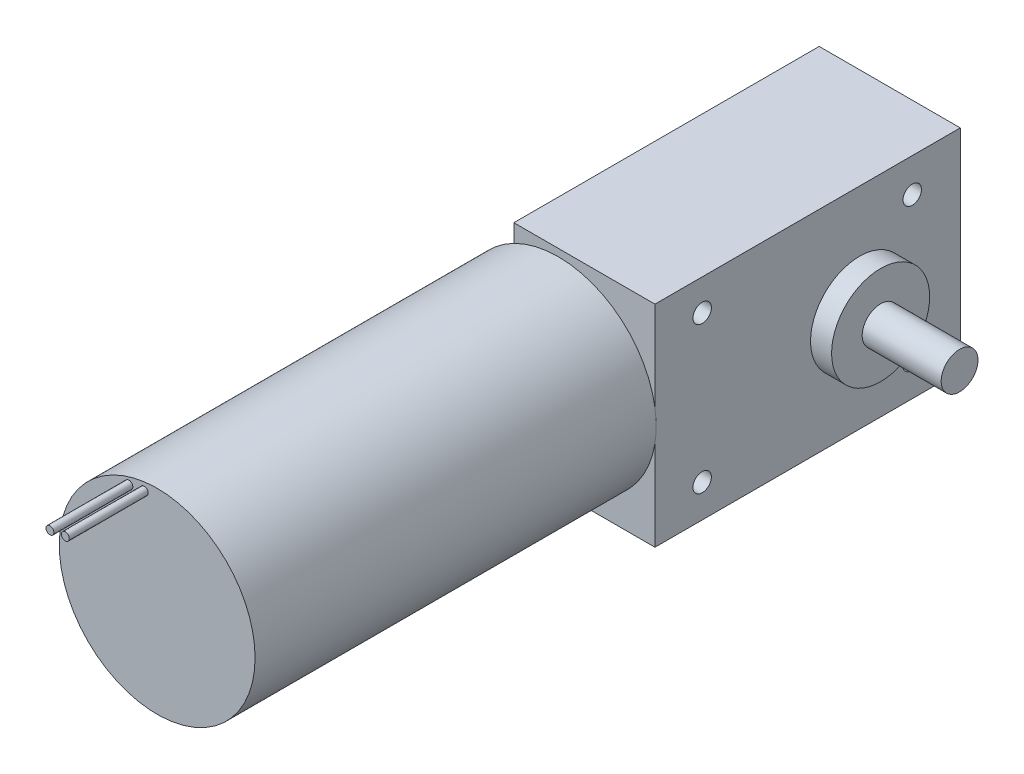
ISO-10303-21;
HEADER;
FILE_DESCRIPTION(('STEP AP214'),'2;1');
FILE_NAME('part.step','',(''),(''),'','','');
FILE_SCHEMA(('AUTOMOTIVE_DESIGN { 1 0 10303 214 1 1 1 1 }'));
ENDSEC;
DATA;
#1=APPLICATION_CONTEXT('core data for automotive mechanical design processes');
#2=APPLICATION_PROTOCOL_DEFINITION('international standard','automotive_design',2000,#1);
#3=PRODUCT_CONTEXT('',#1,'mechanical');
#4=PRODUCT('Part','Part','',(#3));
#5=PRODUCT_RELATED_PRODUCT_CATEGORY('part','',(#4));
#6=PRODUCT_DEFINITION_FORMATION('','',#4);
#7=PRODUCT_DEFINITION_CONTEXT('part definition',#1,'design');
#8=PRODUCT_DEFINITION('design','',#6,#7);
#9=PRODUCT_DEFINITION_SHAPE('','',#8);
#10=(LENGTH_UNIT() NAMED_UNIT(*) SI_UNIT(.MILLI.,.METRE.));
#11=(NAMED_UNIT(*) PLANE_ANGLE_UNIT() SI_UNIT($,.RADIAN.));
#12=(NAMED_UNIT(*) SI_UNIT($,.STERADIAN.) SOLID_ANGLE_UNIT());
#13=UNCERTAINTY_MEASURE_WITH_UNIT(LENGTH_MEASURE(1.E-05),#10,'distance_accuracy_value','');
#14=(GEOMETRIC_REPRESENTATION_CONTEXT(3) GLOBAL_UNCERTAINTY_ASSIGNED_CONTEXT((#13)) GLOBAL_UNIT_ASSIGNED_CONTEXT((#10,
#11,#12)) REPRESENTATION_CONTEXT('',''));
#15=CARTESIAN_POINT('',(0.,0.,0.));
#16=DIRECTION('',(0.,0.,1.));
#17=DIRECTION('',(1.,0.,0.));
#18=AXIS2_PLACEMENT_3D('',#15,#16,#17);
#19=CARTESIAN_POINT('',(-63.8568563516663,21.8656771156772,0.));
#20=DIRECTION('',(0.,0.,1.));
#21=DIRECTION('',(1.,0.,0.));
#22=AXIS2_PLACEMENT_3D('',#19,#20,#21);
#23=PLANE('',#22);
#24=DIRECTION('',(0.,1.,0.));
#25=VECTOR('',#24,1.);
#26=CARTESIAN_POINT('',(-72.2953043376536,41.8359502095322,0.));
#27=LINE('',#26,#25);
#28=CARTESIAN_POINT('',(-72.2953043376536,5.29001436609803,0.));
#29=VERTEX_POINT('',#28);
#30=CARTESIAN_POINT('',(-72.2953043376536,38.4413398652564,0.));
#31=VERTEX_POINT('',#30);
#32=EDGE_CURVE('E48',#29,#31,#27,.T.);
#33=ORIENTED_EDGE('',*,*,#32,.F.);
#34=CARTESIAN_POINT('',(-63.8568563516663,21.8656771156772,0.));
#35=DIRECTION('',(0.,0.,1.));
#36=DIRECTION('',(1.,0.,0.));
#37=AXIS2_PLACEMENT_3D('',#34,#35,#36);
#38=CIRCLE('',#37,18.6);
#39=EDGE_CURVE('E51',#31,#29,#38,.T.);
#40=ORIENTED_EDGE('',*,*,#39,.F.);
#41=EDGE_LOOP('',(#33,#40));
#42=FACE_BOUND('',#41,.T.);
#43=ADVANCED_FACE('F33',(#42),#23,.F.);
#44=DIRECTION('',(0.,-1.,0.));
#45=VECTOR('',#44,1.);
#46=CARTESIAN_POINT('',(-45.4953043376536,41.8359502095322,0.));
#47=LINE('',#46,#45);
#48=CARTESIAN_POINT('',(-45.4953043376536,24.8344155070998,0.));
#49=VERTEX_POINT('',#48);
#50=CARTESIAN_POINT('',(-45.4953043376536,18.8969387242547,0.));
#51=VERTEX_POINT('',#50);
#52=EDGE_CURVE('E132',#49,#51,#47,.T.);
#53=ORIENTED_EDGE('',*,*,#52,.F.);
#54=EDGE_CURVE('E126',#51,#49,#38,.T.);
#55=ORIENTED_EDGE('',*,*,#54,.F.);
#56=EDGE_LOOP('',(#53,#55));
#57=FACE_BOUND('',#56,.T.);
#58=ADVANCED_FACE('F199',(#57),#23,.F.);
#59=CARTESIAN_POINT('',(-63.8568563516663,21.8656771156772,76.2));
#60=DIRECTION('',(0.,0.,-1.));
#61=DIRECTION('',(-1.,0.,0.));
#62=AXIS2_PLACEMENT_3D('',#59,#60,#61);
#63=CYLINDRICAL_SURFACE('',#62,18.6);
#64=CARTESIAN_POINT('',(-63.8568563516663,21.8656771156772,76.2));
#65=DIRECTION('',(0.,0.,1.));
#66=DIRECTION('',(1.,0.,0.));
#67=AXIS2_PLACEMENT_3D('',#64,#65,#66);
#68=CIRCLE('',#67,18.6);
#69=CARTESIAN_POINT('',(-45.2568563516663,21.8656771156772,76.2));
#70=VERTEX_POINT('',#69);
#71=EDGE_CURVE('E129',#70,#70,#68,.T.);
#72=ORIENTED_EDGE('',*,*,#71,.F.);
#73=EDGE_LOOP('',(#72));
#74=FACE_BOUND('',#73,.T.);
#75=EDGE_CURVE('E133',#49,#31,#38,.T.);
#76=ORIENTED_EDGE('',*,*,#75,.T.);
#77=ORIENTED_EDGE('',*,*,#39,.T.);
#78=EDGE_CURVE('E177',#29,#51,#38,.T.);
#79=ORIENTED_EDGE('',*,*,#78,.T.);
#80=ORIENTED_EDGE('',*,*,#54,.T.);
#81=EDGE_LOOP('',(#76,#77,#79,#80));
#82=FACE_BOUND('',#81,.T.);
#83=ADVANCED_FACE('F35',(#74,#82),#63,.T.);
#84=CARTESIAN_POINT('',(-63.8568563516663,21.8656771156772,76.2));
#85=DIRECTION('',(0.,0.,1.));
#86=DIRECTION('',(1.,0.,0.));
#87=AXIS2_PLACEMENT_3D('',#84,#85,#86);
#88=PLANE('',#87);
#89=CARTESIAN_POINT('',(-69.2248738329369,38.3649913808313,76.2));
#90=DIRECTION('',(0.,0.,1.));
#91=DIRECTION('',(1.,0.,0.));
#92=AXIS2_PLACEMENT_3D('',#89,#90,#91);
#93=CIRCLE('',#92,0.749999999999999);
#94=CARTESIAN_POINT('',(-68.4748738329369,38.3649913808313,76.2));
#95=VERTEX_POINT('',#94);
#96=EDGE_CURVE('E111',#95,#95,#93,.T.);
#97=ORIENTED_EDGE('',*,*,#96,.F.);
#98=EDGE_LOOP('',(#97));
#99=FACE_BOUND('',#98,.T.);
#100=CARTESIAN_POINT('',(-66.3052965506381,38.820097554833,76.2));
#101=DIRECTION('',(0.,0.,1.));
#102=DIRECTION('',(1.,0.,0.));
#103=AXIS2_PLACEMENT_3D('',#100,#101,#102);
#104=CIRCLE('',#103,0.749999999999999);
#105=CARTESIAN_POINT('',(-65.5552965506381,38.820097554833,76.2));
#106=VERTEX_POINT('',#105);
#107=EDGE_CURVE('E121',#106,#106,#104,.T.);
#108=ORIENTED_EDGE('',*,*,#107,.F.);
#109=EDGE_LOOP('',(#108));
#110=FACE_BOUND('',#109,.T.);
#111=ORIENTED_EDGE('',*,*,#71,.T.);
#112=EDGE_LOOP('',(#111));
#113=FACE_BOUND('',#112,.T.);
#114=ADVANCED_FACE('F204',(#99,#110,#113),#88,.T.);
#115=CARTESIAN_POINT('',(-66.3052965506381,38.820097554833,91.2));
#116=DIRECTION('',(0.,0.,-1.));
#117=DIRECTION('',(-1.,0.,0.));
#118=AXIS2_PLACEMENT_3D('',#115,#116,#117);
#119=CYLINDRICAL_SURFACE('',#118,0.749999999999999);
#120=CARTESIAN_POINT('',(-66.3052965506381,38.820097554833,91.2));
#121=DIRECTION('',(0.,0.,1.));
#122=DIRECTION('',(1.,0.,0.));
#123=AXIS2_PLACEMENT_3D('',#120,#121,#122);
#124=CIRCLE('',#123,0.749999999999999);
#125=CARTESIAN_POINT('',(-65.5552965506381,38.820097554833,91.2));
#126=VERTEX_POINT('',#125);
#127=EDGE_CURVE('E123',#126,#126,#124,.T.);
#128=ORIENTED_EDGE('',*,*,#127,.F.);
#129=EDGE_LOOP('',(#128));
#130=FACE_BOUND('',#129,.T.);
#131=ORIENTED_EDGE('',*,*,#107,.T.);
#132=EDGE_LOOP('',(#131));
#133=FACE_BOUND('',#132,.T.);
#134=ADVANCED_FACE('F207',(#130,#133),#119,.T.);
#135=CARTESIAN_POINT('',(-66.3052965506381,38.820097554833,91.2));
#136=DIRECTION('',(0.,0.,1.));
#137=DIRECTION('',(1.,0.,0.));
#138=AXIS2_PLACEMENT_3D('',#135,#136,#137);
#139=PLANE('',#138);
#140=ORIENTED_EDGE('',*,*,#127,.T.);
#141=EDGE_LOOP('',(#140));
#142=FACE_BOUND('',#141,.T.);
#143=ADVANCED_FACE('F211',(#142),#139,.T.);
#144=CARTESIAN_POINT('',(-69.2248738329369,38.3649913808313,91.2));
#145=DIRECTION('',(0.,0.,-1.));
#146=DIRECTION('',(-1.,0.,0.));
#147=AXIS2_PLACEMENT_3D('',#144,#145,#146);
#148=CYLINDRICAL_SURFACE('',#147,0.749999999999999);
#149=CARTESIAN_POINT('',(-69.2248738329369,38.3649913808313,91.2));
#150=DIRECTION('',(0.,0.,1.));
#151=DIRECTION('',(1.,0.,0.));
#152=AXIS2_PLACEMENT_3D('',#149,#150,#151);
#153=CIRCLE('',#152,0.749999999999999);
#154=CARTESIAN_POINT('',(-68.4748738329369,38.3649913808313,91.2));
#155=VERTEX_POINT('',#154);
#156=EDGE_CURVE('E114',#155,#155,#153,.T.);
#157=ORIENTED_EDGE('',*,*,#156,.F.);
#158=EDGE_LOOP('',(#157));
#159=FACE_BOUND('',#158,.T.);
#160=ORIENTED_EDGE('',*,*,#96,.T.);
#161=EDGE_LOOP('',(#160));
#162=FACE_BOUND('',#161,.T.);
#163=ADVANCED_FACE('F193',(#159,#162),#148,.T.);
#164=CARTESIAN_POINT('',(-69.2248738329369,38.3649913808313,91.2));
#165=DIRECTION('',(0.,0.,1.));
#166=DIRECTION('',(1.,0.,0.));
#167=AXIS2_PLACEMENT_3D('',#164,#165,#166);
#168=PLANE('',#167);
#169=ORIENTED_EDGE('',*,*,#156,.T.);
#170=EDGE_LOOP('',(#169));
#171=FACE_BOUND('',#170,.T.);
#172=ADVANCED_FACE('F187',(#171),#168,.T.);
#173=CARTESIAN_POINT('',(0.,0.,0.));
#174=DIRECTION('',(0.,0.,1.));
#175=DIRECTION('',(1.,0.,0.));
#176=AXIS2_PLACEMENT_3D('',#173,#174,#175);
#177=PLANE('',#176);
#178=ORIENTED_EDGE('',*,*,#75,.F.);
#179=CARTESIAN_POINT('',(-45.4953043376536,41.8359502095322,0.));
#180=VERTEX_POINT('',#179);
#181=EDGE_CURVE('E143',#180,#49,#47,.T.);
#182=ORIENTED_EDGE('',*,*,#181,.F.);
#183=DIRECTION('',(1.,0.,0.));
#184=VECTOR('',#183,1.);
#185=CARTESIAN_POINT('',(-72.2953043376536,41.8359502095322,0.));
#186=LINE('',#185,#184);
#187=CARTESIAN_POINT('',(-72.2953043376536,41.8359502095322,0.));
#188=VERTEX_POINT('',#187);
#189=EDGE_CURVE('E147',#188,#180,#186,.T.);
#190=ORIENTED_EDGE('',*,*,#189,.F.);
#191=EDGE_CURVE('E109',#31,#188,#27,.T.);
#192=ORIENTED_EDGE('',*,*,#191,.F.);
#193=EDGE_LOOP('',(#178,#182,#190,#192));
#194=FACE_BOUND('',#193,.T.);
#195=ADVANCED_FACE('F185',(#194),#177,.T.);
#196=ORIENTED_EDGE('',*,*,#78,.F.);
#197=CARTESIAN_POINT('',(-72.2953043376536,1.8359502095322,0.));
#198=VERTEX_POINT('',#197);
#199=EDGE_CURVE('E140',#198,#29,#27,.T.);
#200=ORIENTED_EDGE('',*,*,#199,.F.);
#201=DIRECTION('',(-1.,0.,0.));
#202=VECTOR('',#201,1.);
#203=CARTESIAN_POINT('',(-72.2953043376536,1.8359502095322,0.));
#204=LINE('',#203,#202);
#205=CARTESIAN_POINT('',(-45.4953043376536,1.8359502095322,0.));
#206=VERTEX_POINT('',#205);
#207=EDGE_CURVE('E104',#206,#198,#204,.T.);
#208=ORIENTED_EDGE('',*,*,#207,.F.);
#209=EDGE_CURVE('E144',#51,#206,#47,.T.);
#210=ORIENTED_EDGE('',*,*,#209,.F.);
#211=EDGE_LOOP('',(#196,#200,#208,#210));
#212=FACE_BOUND('',#211,.T.);
#213=ADVANCED_FACE('F176',(#212),#177,.T.);
#214=CARTESIAN_POINT('',(-72.2953043376536,41.8359502095322,-58.));
#215=DIRECTION('',(1.,0.,0.));
#216=DIRECTION('',(0.,0.,-1.));
#217=AXIS2_PLACEMENT_3D('',#214,#215,#216);
#218=PLANE('',#217);
#219=CARTESIAN_POINT('',(-72.2953043376536,21.2359502095322,-38.6));
#220=DIRECTION('',(1.,0.,0.));
#221=DIRECTION('',(0.,0.,-1.));
#222=AXIS2_PLACEMENT_3D('',#219,#220,#221);
#223=CIRCLE('',#222,9.4);
#224=CARTESIAN_POINT('',(-72.2953043376536,21.2359502095322,-48.));
#225=VERTEX_POINT('',#224);
#226=EDGE_CURVE('E134',#225,#225,#223,.F.);
#227=ORIENTED_EDGE('',*,*,#226,.F.);
#228=EDGE_LOOP('',(#227));
#229=FACE_BOUND('',#228,.T.);
#230=CARTESIAN_POINT('',(-72.2953043376536,6.7759502095322,-9.15));
#231=DIRECTION('',(-1.,0.,0.));
#232=DIRECTION('',(0.,0.,1.));
#233=AXIS2_PLACEMENT_3D('',#230,#231,#232);
#234=CIRCLE('',#233,1.75);
#235=CARTESIAN_POINT('',(-72.2953043376536,6.7759502095322,-7.4));
#236=VERTEX_POINT('',#235);
#237=EDGE_CURVE('E356',#236,#236,#234,.T.);
#238=ORIENTED_EDGE('',*,*,#237,.F.);
#239=EDGE_LOOP('',(#238));
#240=FACE_BOUND('',#239,.T.);
#241=CARTESIAN_POINT('',(-72.2953043376536,6.7759502095322,-48.85));
#242=DIRECTION('',(-1.,0.,0.));
#243=DIRECTION('',(0.,0.,1.));
#244=AXIS2_PLACEMENT_3D('',#241,#242,#243);
#245=CIRCLE('',#244,1.75);
#246=CARTESIAN_POINT('',(-72.2953043376536,6.7759502095322,-47.1));
#247=VERTEX_POINT('',#246);
#248=EDGE_CURVE('E360',#247,#247,#245,.T.);
#249=ORIENTED_EDGE('',*,*,#248,.F.);
#250=EDGE_LOOP('',(#249));
#251=FACE_BOUND('',#250,.T.);
#252=CARTESIAN_POINT('',(-72.2953043376536,35.5359502095322,-9.15));
#253=DIRECTION('',(-1.,0.,0.));
#254=DIRECTION('',(0.,0.,1.));
#255=AXIS2_PLACEMENT_3D('',#252,#253,#254);
#256=CIRCLE('',#255,1.75);
#257=CARTESIAN_POINT('',(-72.2953043376536,35.5359502095322,-7.4));
#258=VERTEX_POINT('',#257);
#259=EDGE_CURVE('E158',#258,#258,#256,.T.);
#260=ORIENTED_EDGE('',*,*,#259,.F.);
#261=EDGE_LOOP('',(#260));
#262=FACE_BOUND('',#261,.T.);
#263=CARTESIAN_POINT('',(-72.2953043376536,35.5359502095322,-48.85));
#264=DIRECTION('',(-1.,0.,0.));
#265=DIRECTION('',(0.,0.,1.));
#266=AXIS2_PLACEMENT_3D('',#263,#264,#265);
#267=CIRCLE('',#266,1.75);
#268=CARTESIAN_POINT('',(-72.2953043376536,35.5359502095322,-47.1));
#269=VERTEX_POINT('',#268);
#270=EDGE_CURVE('E150',#269,#269,#267,.T.);
#271=ORIENTED_EDGE('',*,*,#270,.F.);
#272=EDGE_LOOP('',(#271));
#273=FACE_BOUND('',#272,.T.);
#274=ORIENTED_EDGE('',*,*,#199,.T.);
#275=ORIENTED_EDGE('',*,*,#32,.T.);
#276=ORIENTED_EDGE('',*,*,#191,.T.);
#277=DIRECTION('',(0.,0.,1.));
#278=VECTOR('',#277,1.);
#279=CARTESIAN_POINT('',(-72.2953043376536,41.8359502095322,-58.));
#280=LINE('',#279,#278);
#281=CARTESIAN_POINT('',(-72.2953043376536,41.8359502095322,-58.));
#282=VERTEX_POINT('',#281);
#283=EDGE_CURVE('E89',#282,#188,#280,.T.);
#284=ORIENTED_EDGE('',*,*,#283,.F.);
#285=DIRECTION('',(0.,1.,0.));
#286=VECTOR('',#285,1.);
#287=CARTESIAN_POINT('',(-72.2953043376536,41.8359502095322,-58.));
#288=LINE('',#287,#286);
#289=CARTESIAN_POINT('',(-72.2953043376536,1.8359502095322,-58.));
#290=VERTEX_POINT('',#289);
#291=EDGE_CURVE('E95',#290,#282,#288,.T.);
#292=ORIENTED_EDGE('',*,*,#291,.F.);
#293=DIRECTION('',(0.,0.,1.));
#294=VECTOR('',#293,1.);
#295=CARTESIAN_POINT('',(-72.2953043376536,1.8359502095322,-58.));
#296=LINE('',#295,#294);
#297=EDGE_CURVE('E161',#290,#198,#296,.T.);
#298=ORIENTED_EDGE('',*,*,#297,.T.);
#299=EDGE_LOOP('',(#274,#275,#276,#284,#292,#298));
#300=FACE_BOUND('',#299,.T.);
#301=ADVANCED_FACE('F107',(#229,#240,#251,#262,#273,#300),#218,.F.);
#302=CARTESIAN_POINT('',(-72.2953043376536,41.8359502095322,-58.));
#303=DIRECTION('',(0.,-1.,0.));
#304=DIRECTION('',(0.,0.,-1.));
#305=AXIS2_PLACEMENT_3D('',#302,#303,#304);
#306=PLANE('',#305);
#307=ORIENTED_EDGE('',*,*,#189,.T.);
#308=DIRECTION('',(0.,0.,1.));
#309=VECTOR('',#308,1.);
#310=CARTESIAN_POINT('',(-45.4953043376536,41.8359502095322,-58.));
#311=LINE('',#310,#309);
#312=CARTESIAN_POINT('',(-45.4953043376536,41.8359502095322,-58.));
#313=VERTEX_POINT('',#312);
#314=EDGE_CURVE('E91',#313,#180,#311,.T.);
#315=ORIENTED_EDGE('',*,*,#314,.F.);
#316=DIRECTION('',(1.,0.,0.));
#317=VECTOR('',#316,1.);
#318=CARTESIAN_POINT('',(-72.2953043376536,41.8359502095322,-58.));
#319=LINE('',#318,#317);
#320=EDGE_CURVE('E85',#282,#313,#319,.T.);
#321=ORIENTED_EDGE('',*,*,#320,.F.);
#322=ORIENTED_EDGE('',*,*,#283,.T.);
#323=EDGE_LOOP('',(#307,#315,#321,#322));
#324=FACE_BOUND('',#323,.T.);
#325=ADVANCED_FACE('F87',(#324),#306,.F.);
#326=CARTESIAN_POINT('',(-45.4953043376536,41.8359502095322,-58.));
#327=DIRECTION('',(-1.,0.,0.));
#328=DIRECTION('',(0.,0.,1.));
#329=AXIS2_PLACEMENT_3D('',#326,#327,#328);
#330=PLANE('',#329);
#331=CARTESIAN_POINT('',(-45.4953043376536,20.9659502095322,-38.87));
#332=DIRECTION('',(-1.,0.,0.));
#333=DIRECTION('',(0.,0.,1.));
#334=AXIS2_PLACEMENT_3D('',#331,#332,#333);
#335=CIRCLE('',#334,9.315);
#336=CARTESIAN_POINT('',(-45.4953043376536,20.9659502095322,-29.555));
#337=VERTEX_POINT('',#336);
#338=EDGE_CURVE('E37',#337,#337,#335,.F.);
#339=ORIENTED_EDGE('',*,*,#338,.F.);
#340=EDGE_LOOP('',(#339));
#341=FACE_BOUND('',#340,.T.);
#342=CARTESIAN_POINT('',(-45.4953043376536,35.4059502095322,-48.88));
#343=DIRECTION('',(1.,0.,0.));
#344=DIRECTION('',(0.,0.,-1.));
#345=AXIS2_PLACEMENT_3D('',#342,#343,#344);
#346=CIRCLE('',#345,1.75);
#347=CARTESIAN_POINT('',(-45.4953043376536,35.4059502095322,-50.63));
#348=VERTEX_POINT('',#347);
#349=EDGE_CURVE('E327',#348,#348,#346,.T.);
#350=ORIENTED_EDGE('',*,*,#349,.F.);
#351=EDGE_LOOP('',(#350));
#352=FACE_BOUND('',#351,.T.);
#353=CARTESIAN_POINT('',(-45.4953043376536,8.2659502095322,-48.78));
#354=DIRECTION('',(1.,0.,0.));
#355=DIRECTION('',(0.,0.,-1.));
#356=AXIS2_PLACEMENT_3D('',#353,#354,#355);
#357=CIRCLE('',#356,1.75);
#358=CARTESIAN_POINT('',(-45.4953043376536,8.2659502095322,-50.53));
#359=VERTEX_POINT('',#358);
#360=EDGE_CURVE('E333',#359,#359,#357,.T.);
#361=ORIENTED_EDGE('',*,*,#360,.F.);
#362=EDGE_LOOP('',(#361));
#363=FACE_BOUND('',#362,.T.);
#364=CARTESIAN_POINT('',(-45.4953043376536,8.0659502095322,-8.97));
#365=DIRECTION('',(1.,0.,0.));
#366=DIRECTION('',(0.,0.,-1.));
#367=AXIS2_PLACEMENT_3D('',#364,#365,#366);
#368=CIRCLE('',#367,1.75);
#369=CARTESIAN_POINT('',(-45.4953043376536,8.0659502095322,-10.72));
#370=VERTEX_POINT('',#369);
#371=EDGE_CURVE('E339',#370,#370,#368,.T.);
#372=ORIENTED_EDGE('',*,*,#371,.F.);
#373=EDGE_LOOP('',(#372));
#374=FACE_BOUND('',#373,.T.);
#375=CARTESIAN_POINT('',(-45.4953043376536,35.9159502095322,-8.97));
#376=DIRECTION('',(1.,0.,0.));
#377=DIRECTION('',(0.,0.,-1.));
#378=AXIS2_PLACEMENT_3D('',#375,#376,#377);
#379=CIRCLE('',#378,1.75);
#380=CARTESIAN_POINT('',(-45.4953043376536,35.9159502095322,-10.72));
#381=VERTEX_POINT('',#380);
#382=EDGE_CURVE('E345',#381,#381,#379,.T.);
#383=ORIENTED_EDGE('',*,*,#382,.F.);
#384=EDGE_LOOP('',(#383));
#385=FACE_BOUND('',#384,.T.);
#386=ORIENTED_EDGE('',*,*,#181,.T.);
#387=ORIENTED_EDGE('',*,*,#52,.T.);
#388=ORIENTED_EDGE('',*,*,#209,.T.);
#389=DIRECTION('',(0.,0.,1.));
#390=VECTOR('',#389,1.);
#391=CARTESIAN_POINT('',(-45.4953043376536,1.8359502095322,-58.));
#392=LINE('',#391,#390);
#393=CARTESIAN_POINT('',(-45.4953043376536,1.8359502095322,-58.));
#394=VERTEX_POINT('',#393);
#395=EDGE_CURVE('E116',#394,#206,#392,.T.);
#396=ORIENTED_EDGE('',*,*,#395,.F.);
#397=DIRECTION('',(0.,-1.,0.));
#398=VECTOR('',#397,1.);
#399=CARTESIAN_POINT('',(-45.4953043376536,41.8359502095322,-58.));
#400=LINE('',#399,#398);
#401=EDGE_CURVE('E94',#313,#394,#400,.T.);
#402=ORIENTED_EDGE('',*,*,#401,.F.);
#403=ORIENTED_EDGE('',*,*,#314,.T.);
#404=EDGE_LOOP('',(#386,#387,#388,#396,#402,#403));
#405=FACE_BOUND('',#404,.T.);
#406=ADVANCED_FACE('F170',(#341,#352,#363,#374,#385,#405),#330,.F.);
#407=CARTESIAN_POINT('',(-72.2953043376536,1.8359502095322,-58.));
#408=DIRECTION('',(0.,1.,0.));
#409=DIRECTION('',(-1.,0.,0.));
#410=AXIS2_PLACEMENT_3D('',#407,#408,#409);
#411=PLANE('',#410);
#412=ORIENTED_EDGE('',*,*,#207,.T.);
#413=ORIENTED_EDGE('',*,*,#297,.F.);
#414=DIRECTION('',(-1.,0.,0.));
#415=VECTOR('',#414,1.);
#416=CARTESIAN_POINT('',(-72.2953043376536,1.8359502095322,-58.));
#417=LINE('',#416,#415);
#418=EDGE_CURVE('E100',#394,#290,#417,.T.);
#419=ORIENTED_EDGE('',*,*,#418,.F.);
#420=ORIENTED_EDGE('',*,*,#395,.T.);
#421=EDGE_LOOP('',(#412,#413,#419,#420));
#422=FACE_BOUND('',#421,.T.);
#423=ADVANCED_FACE('F175',(#422),#411,.F.);
#424=CARTESIAN_POINT('',(0.,0.,-58.));
#425=DIRECTION('',(0.,0.,1.));
#426=DIRECTION('',(1.,0.,0.));
#427=AXIS2_PLACEMENT_3D('',#424,#425,#426);
#428=PLANE('',#427);
#429=ORIENTED_EDGE('',*,*,#291,.T.);
#430=ORIENTED_EDGE('',*,*,#320,.T.);
#431=ORIENTED_EDGE('',*,*,#401,.T.);
#432=ORIENTED_EDGE('',*,*,#418,.T.);
#433=EDGE_LOOP('',(#429,#430,#431,#432));
#434=FACE_BOUND('',#433,.T.);
#435=ADVANCED_FACE('F98',(#434),#428,.F.);
#436=CARTESIAN_POINT('',(-67.2953043376536,35.5359502095322,-48.85));
#437=DIRECTION('',(-1.,0.,0.));
#438=DIRECTION('',(0.,0.,1.));
#439=AXIS2_PLACEMENT_3D('',#436,#437,#438);
#440=CYLINDRICAL_SURFACE('',#439,1.75);
#441=CARTESIAN_POINT('',(-67.2953043376536,35.5359502095322,-48.85));
#442=DIRECTION('',(-1.,0.,0.));
#443=DIRECTION('',(0.,0.,1.));
#444=AXIS2_PLACEMENT_3D('',#441,#442,#443);
#445=CIRCLE('',#444,1.75);
#446=CARTESIAN_POINT('',(-67.2953043376536,35.5359502095322,-47.1));
#447=VERTEX_POINT('',#446);
#448=EDGE_CURVE('E148',#447,#447,#445,.T.);
#449=ORIENTED_EDGE('',*,*,#448,.F.);
#450=EDGE_LOOP('',(#449));
#451=FACE_BOUND('',#450,.T.);
#452=ORIENTED_EDGE('',*,*,#270,.T.);
#453=EDGE_LOOP('',(#452));
#454=FACE_BOUND('',#453,.T.);
#455=ADVANCED_FACE('F230',(#451,#454),#440,.F.);
#456=CARTESIAN_POINT('',(-67.2953043376536,35.5359502095322,-48.85));
#457=DIRECTION('',(-1.,0.,0.));
#458=DIRECTION('',(0.,0.,1.));
#459=AXIS2_PLACEMENT_3D('',#456,#457,#458);
#460=PLANE('',#459);
#461=ORIENTED_EDGE('',*,*,#448,.T.);
#462=EDGE_LOOP('',(#461));
#463=FACE_BOUND('',#462,.T.);
#464=ADVANCED_FACE('F234',(#463),#460,.T.);
#465=CARTESIAN_POINT('',(-67.2953043376536,35.5359502095322,-9.15));
#466=DIRECTION('',(-1.,0.,0.));
#467=DIRECTION('',(0.,0.,1.));
#468=AXIS2_PLACEMENT_3D('',#465,#466,#467);
#469=CYLINDRICAL_SURFACE('',#468,1.75);
#470=CARTESIAN_POINT('',(-67.2953043376536,35.5359502095322,-9.15));
#471=DIRECTION('',(-1.,0.,0.));
#472=DIRECTION('',(0.,0.,1.));
#473=AXIS2_PLACEMENT_3D('',#470,#471,#472);
#474=CIRCLE('',#473,1.75);
#475=CARTESIAN_POINT('',(-67.2953043376536,35.5359502095322,-7.4));
#476=VERTEX_POINT('',#475);
#477=EDGE_CURVE('E155',#476,#476,#474,.T.);
#478=ORIENTED_EDGE('',*,*,#477,.F.);
#479=EDGE_LOOP('',(#478));
#480=FACE_BOUND('',#479,.T.);
#481=ORIENTED_EDGE('',*,*,#259,.T.);
#482=EDGE_LOOP('',(#481));
#483=FACE_BOUND('',#482,.T.);
#484=ADVANCED_FACE('F240',(#480,#483),#469,.F.);
#485=CARTESIAN_POINT('',(-67.2953043376536,35.5359502095322,-9.15));
#486=DIRECTION('',(-1.,0.,0.));
#487=DIRECTION('',(0.,0.,1.));
#488=AXIS2_PLACEMENT_3D('',#485,#486,#487);
#489=PLANE('',#488);
#490=ORIENTED_EDGE('',*,*,#477,.T.);
#491=EDGE_LOOP('',(#490));
#492=FACE_BOUND('',#491,.T.);
#493=ADVANCED_FACE('F243',(#492),#489,.T.);
#494=CARTESIAN_POINT('',(-67.2953043376536,6.7759502095322,-48.85));
#495=DIRECTION('',(-1.,0.,0.));
#496=DIRECTION('',(0.,0.,1.));
#497=AXIS2_PLACEMENT_3D('',#494,#495,#496);
#498=CYLINDRICAL_SURFACE('',#497,1.75);
#499=CARTESIAN_POINT('',(-67.2953043376536,6.7759502095322,-48.85));
#500=DIRECTION('',(-1.,0.,0.));
#501=DIRECTION('',(0.,0.,1.));
#502=AXIS2_PLACEMENT_3D('',#499,#500,#501);
#503=CIRCLE('',#502,1.75);
#504=CARTESIAN_POINT('',(-67.2953043376536,6.7759502095322,-47.1));
#505=VERTEX_POINT('',#504);
#506=EDGE_CURVE('E363',#505,#505,#503,.T.);
#507=ORIENTED_EDGE('',*,*,#506,.F.);
#508=EDGE_LOOP('',(#507));
#509=FACE_BOUND('',#508,.T.);
#510=ORIENTED_EDGE('',*,*,#248,.T.);
#511=EDGE_LOOP('',(#510));
#512=FACE_BOUND('',#511,.T.);
#513=ADVANCED_FACE('F247',(#509,#512),#498,.F.);
#514=CARTESIAN_POINT('',(-67.2953043376536,6.7759502095322,-48.85));
#515=DIRECTION('',(-1.,0.,0.));
#516=DIRECTION('',(0.,0.,1.));
#517=AXIS2_PLACEMENT_3D('',#514,#515,#516);
#518=PLANE('',#517);
#519=ORIENTED_EDGE('',*,*,#506,.T.);
#520=EDGE_LOOP('',(#519));
#521=FACE_BOUND('',#520,.T.);
#522=ADVANCED_FACE('F251',(#521),#518,.T.);
#523=CARTESIAN_POINT('',(-67.2953043376536,6.7759502095322,-9.15));
#524=DIRECTION('',(-1.,0.,0.));
#525=DIRECTION('',(0.,0.,1.));
#526=AXIS2_PLACEMENT_3D('',#523,#524,#525);
#527=CYLINDRICAL_SURFACE('',#526,1.75);
#528=CARTESIAN_POINT('',(-67.2953043376536,6.7759502095322,-9.15));
#529=DIRECTION('',(-1.,0.,0.));
#530=DIRECTION('',(0.,0.,1.));
#531=AXIS2_PLACEMENT_3D('',#528,#529,#530);
#532=CIRCLE('',#531,1.75);
#533=CARTESIAN_POINT('',(-67.2953043376536,6.7759502095322,-7.4));
#534=VERTEX_POINT('',#533);
#535=EDGE_CURVE('E357',#534,#534,#532,.T.);
#536=ORIENTED_EDGE('',*,*,#535,.F.);
#537=EDGE_LOOP('',(#536));
#538=FACE_BOUND('',#537,.T.);
#539=ORIENTED_EDGE('',*,*,#237,.T.);
#540=EDGE_LOOP('',(#539));
#541=FACE_BOUND('',#540,.T.);
#542=ADVANCED_FACE('F255',(#538,#541),#527,.F.);
#543=CARTESIAN_POINT('',(-67.2953043376536,6.7759502095322,-9.15));
#544=DIRECTION('',(-1.,0.,0.));
#545=DIRECTION('',(0.,0.,1.));
#546=AXIS2_PLACEMENT_3D('',#543,#544,#545);
#547=PLANE('',#546);
#548=ORIENTED_EDGE('',*,*,#535,.T.);
#549=EDGE_LOOP('',(#548));
#550=FACE_BOUND('',#549,.T.);
#551=ADVANCED_FACE('F259',(#550),#547,.T.);
#552=CARTESIAN_POINT('',(-76.2953043376536,21.2359502095322,-38.6));
#553=DIRECTION('',(1.,0.,0.));
#554=DIRECTION('',(0.,0.,-1.));
#555=AXIS2_PLACEMENT_3D('',#552,#553,#554);
#556=CYLINDRICAL_SURFACE('',#555,9.4);
#557=CARTESIAN_POINT('',(-76.2953043376536,21.2359502095322,-38.6));
#558=DIRECTION('',(-1.,0.,0.));
#559=DIRECTION('',(0.,0.,1.));
#560=AXIS2_PLACEMENT_3D('',#557,#558,#559);
#561=CIRCLE('',#560,9.4);
#562=CARTESIAN_POINT('',(-76.2953043376536,21.2359502095322,-29.2));
#563=VERTEX_POINT('',#562);
#564=EDGE_CURVE('E351',#563,#563,#561,.T.);
#565=ORIENTED_EDGE('',*,*,#564,.F.);
#566=EDGE_LOOP('',(#565));
#567=FACE_BOUND('',#566,.T.);
#568=ORIENTED_EDGE('',*,*,#226,.T.);
#569=EDGE_LOOP('',(#568));
#570=FACE_BOUND('',#569,.T.);
#571=ADVANCED_FACE('F263',(#567,#570),#556,.T.);
#572=CARTESIAN_POINT('',(-76.2953043376536,21.2359502095322,-38.6));
#573=DIRECTION('',(-1.,0.,0.));
#574=DIRECTION('',(0.,0.,1.));
#575=AXIS2_PLACEMENT_3D('',#572,#573,#574);
#576=PLANE('',#575);
#577=ORIENTED_EDGE('',*,*,#564,.T.);
#578=EDGE_LOOP('',(#577));
#579=FACE_BOUND('',#578,.T.);
#580=ADVANCED_FACE('F267',(#579),#576,.T.);
#581=CARTESIAN_POINT('',(-55.4953043376536,35.9159502095322,-8.97));
#582=DIRECTION('',(1.,0.,0.));
#583=DIRECTION('',(0.,0.,-1.));
#584=AXIS2_PLACEMENT_3D('',#581,#582,#583);
#585=CYLINDRICAL_SURFACE('',#584,1.75);
#586=CARTESIAN_POINT('',(-55.4953043376536,35.9159502095322,-8.97));
#587=DIRECTION('',(1.,0.,0.));
#588=DIRECTION('',(0.,0.,-1.));
#589=AXIS2_PLACEMENT_3D('',#586,#587,#588);
#590=CIRCLE('',#589,1.75);
#591=CARTESIAN_POINT('',(-55.4953043376536,35.9159502095322,-10.72));
#592=VERTEX_POINT('',#591);
#593=EDGE_CURVE('E348',#592,#592,#590,.T.);
#594=ORIENTED_EDGE('',*,*,#593,.F.);
#595=EDGE_LOOP('',(#594));
#596=FACE_BOUND('',#595,.T.);
#597=ORIENTED_EDGE('',*,*,#382,.T.);
#598=EDGE_LOOP('',(#597));
#599=FACE_BOUND('',#598,.T.);
#600=ADVANCED_FACE('F271',(#596,#599),#585,.F.);
#601=CARTESIAN_POINT('',(-55.4953043376536,35.9159502095322,-8.97));
#602=DIRECTION('',(1.,0.,0.));
#603=DIRECTION('',(0.,0.,-1.));
#604=AXIS2_PLACEMENT_3D('',#601,#602,#603);
#605=PLANE('',#604);
#606=ORIENTED_EDGE('',*,*,#593,.T.);
#607=EDGE_LOOP('',(#606));
#608=FACE_BOUND('',#607,.T.);
#609=ADVANCED_FACE('F275',(#608),#605,.T.);
#610=CARTESIAN_POINT('',(-55.4953043376536,8.0659502095322,-8.97));
#611=DIRECTION('',(1.,0.,0.));
#612=DIRECTION('',(0.,0.,-1.));
#613=AXIS2_PLACEMENT_3D('',#610,#611,#612);
#614=CYLINDRICAL_SURFACE('',#613,1.75);
#615=CARTESIAN_POINT('',(-55.4953043376536,8.0659502095322,-8.97));
#616=DIRECTION('',(1.,0.,0.));
#617=DIRECTION('',(0.,0.,-1.));
#618=AXIS2_PLACEMENT_3D('',#615,#616,#617);
#619=CIRCLE('',#618,1.75);
#620=CARTESIAN_POINT('',(-55.4953043376536,8.0659502095322,-10.72));
#621=VERTEX_POINT('',#620);
#622=EDGE_CURVE('E342',#621,#621,#619,.T.);
#623=ORIENTED_EDGE('',*,*,#622,.F.);
#624=EDGE_LOOP('',(#623));
#625=FACE_BOUND('',#624,.T.);
#626=ORIENTED_EDGE('',*,*,#371,.T.);
#627=EDGE_LOOP('',(#626));
#628=FACE_BOUND('',#627,.T.);
#629=ADVANCED_FACE('F279',(#625,#628),#614,.F.);
#630=CARTESIAN_POINT('',(-55.4953043376536,8.0659502095322,-8.97));
#631=DIRECTION('',(1.,0.,0.));
#632=DIRECTION('',(0.,0.,-1.));
#633=AXIS2_PLACEMENT_3D('',#630,#631,#632);
#634=PLANE('',#633);
#635=ORIENTED_EDGE('',*,*,#622,.T.);
#636=EDGE_LOOP('',(#635));
#637=FACE_BOUND('',#636,.T.);
#638=ADVANCED_FACE('F283',(#637),#634,.T.);
#639=CARTESIAN_POINT('',(-55.4953043376536,8.2659502095322,-48.78));
#640=DIRECTION('',(1.,0.,0.));
#641=DIRECTION('',(0.,0.,-1.));
#642=AXIS2_PLACEMENT_3D('',#639,#640,#641);
#643=CYLINDRICAL_SURFACE('',#642,1.75);
#644=CARTESIAN_POINT('',(-55.4953043376536,8.2659502095322,-48.78));
#645=DIRECTION('',(1.,0.,0.));
#646=DIRECTION('',(0.,0.,-1.));
#647=AXIS2_PLACEMENT_3D('',#644,#645,#646);
#648=CIRCLE('',#647,1.75);
#649=CARTESIAN_POINT('',(-55.4953043376536,8.2659502095322,-50.53));
#650=VERTEX_POINT('',#649);
#651=EDGE_CURVE('E336',#650,#650,#648,.T.);
#652=ORIENTED_EDGE('',*,*,#651,.F.);
#653=EDGE_LOOP('',(#652));
#654=FACE_BOUND('',#653,.T.);
#655=ORIENTED_EDGE('',*,*,#360,.T.);
#656=EDGE_LOOP('',(#655));
#657=FACE_BOUND('',#656,.T.);
#658=ADVANCED_FACE('F287',(#654,#657),#643,.F.);
#659=CARTESIAN_POINT('',(-55.4953043376536,8.2659502095322,-48.78));
#660=DIRECTION('',(1.,0.,0.));
#661=DIRECTION('',(0.,0.,-1.));
#662=AXIS2_PLACEMENT_3D('',#659,#660,#661);
#663=PLANE('',#662);
#664=ORIENTED_EDGE('',*,*,#651,.T.);
#665=EDGE_LOOP('',(#664));
#666=FACE_BOUND('',#665,.T.);
#667=ADVANCED_FACE('F291',(#666),#663,.T.);
#668=CARTESIAN_POINT('',(-55.4953043376536,35.4059502095322,-48.88));
#669=DIRECTION('',(1.,0.,0.));
#670=DIRECTION('',(0.,0.,-1.));
#671=AXIS2_PLACEMENT_3D('',#668,#669,#670);
#672=CYLINDRICAL_SURFACE('',#671,1.75);
#673=CARTESIAN_POINT('',(-55.4953043376536,35.4059502095322,-48.88));
#674=DIRECTION('',(1.,0.,0.));
#675=DIRECTION('',(0.,0.,-1.));
#676=AXIS2_PLACEMENT_3D('',#673,#674,#675);
#677=CIRCLE('',#676,1.75);
#678=CARTESIAN_POINT('',(-55.4953043376536,35.4059502095322,-50.63));
#679=VERTEX_POINT('',#678);
#680=EDGE_CURVE('E330',#679,#679,#677,.T.);
#681=ORIENTED_EDGE('',*,*,#680,.F.);
#682=EDGE_LOOP('',(#681));
#683=FACE_BOUND('',#682,.T.);
#684=ORIENTED_EDGE('',*,*,#349,.T.);
#685=EDGE_LOOP('',(#684));
#686=FACE_BOUND('',#685,.T.);
#687=ADVANCED_FACE('F295',(#683,#686),#672,.F.);
#688=CARTESIAN_POINT('',(-55.4953043376536,35.4059502095322,-48.88));
#689=DIRECTION('',(1.,0.,0.));
#690=DIRECTION('',(0.,0.,-1.));
#691=AXIS2_PLACEMENT_3D('',#688,#689,#690);
#692=PLANE('',#691);
#693=ORIENTED_EDGE('',*,*,#680,.T.);
#694=EDGE_LOOP('',(#693));
#695=FACE_BOUND('',#694,.T.);
#696=ADVANCED_FACE('F299',(#695),#692,.T.);
#697=CARTESIAN_POINT('',(-41.4953043376536,20.9659502095322,-38.87));
#698=DIRECTION('',(-1.,0.,0.));
#699=DIRECTION('',(0.,0.,1.));
#700=AXIS2_PLACEMENT_3D('',#697,#698,#699);
#701=CYLINDRICAL_SURFACE('',#700,9.315);
#702=CARTESIAN_POINT('',(-41.4953043376536,20.9659502095322,-38.87));
#703=DIRECTION('',(1.,0.,0.));
#704=DIRECTION('',(0.,0.,-1.));
#705=AXIS2_PLACEMENT_3D('',#702,#703,#704);
#706=CIRCLE('',#705,9.315);
#707=CARTESIAN_POINT('',(-41.4953043376536,20.9659502095322,-48.185));
#708=VERTEX_POINT('',#707);
#709=EDGE_CURVE('E324',#708,#708,#706,.T.);
#710=ORIENTED_EDGE('',*,*,#709,.F.);
#711=EDGE_LOOP('',(#710));
#712=FACE_BOUND('',#711,.T.);
#713=ORIENTED_EDGE('',*,*,#338,.T.);
#714=EDGE_LOOP('',(#713));
#715=FACE_BOUND('',#714,.T.);
#716=ADVANCED_FACE('F303',(#712,#715),#701,.T.);
#717=CARTESIAN_POINT('',(-41.4953043376536,20.9659502095322,-38.87));
#718=DIRECTION('',(1.,0.,0.));
#719=DIRECTION('',(0.,0.,-1.));
#720=AXIS2_PLACEMENT_3D('',#717,#718,#719);
#721=PLANE('',#720);
#722=CARTESIAN_POINT('',(-41.4953043376536,20.9659502095322,-38.87));
#723=DIRECTION('',(1.,0.,0.));
#724=DIRECTION('',(0.,0.,-1.));
#725=AXIS2_PLACEMENT_3D('',#722,#723,#724);
#726=CIRCLE('',#725,3.5);
#727=CARTESIAN_POINT('',(-41.4953043376536,20.9659502095322,-42.37));
#728=VERTEX_POINT('',#727);
#729=EDGE_CURVE('E11',#728,#728,#726,.T.);
#730=ORIENTED_EDGE('',*,*,#729,.F.);
#731=EDGE_LOOP('',(#730));
#732=FACE_BOUND('',#731,.T.);
#733=ORIENTED_EDGE('',*,*,#709,.T.);
#734=EDGE_LOOP('',(#733));
#735=FACE_BOUND('',#734,.T.);
#736=ADVANCED_FACE('F307',(#732,#735),#721,.T.);
#737=CARTESIAN_POINT('',(-26.4953043376536,20.9659502095322,-38.87));
#738=DIRECTION('',(-1.,0.,0.));
#739=DIRECTION('',(0.,0.,1.));
#740=AXIS2_PLACEMENT_3D('',#737,#738,#739);
#741=CYLINDRICAL_SURFACE('',#740,3.5);
#742=CARTESIAN_POINT('',(-26.4953043376536,20.9659502095322,-38.87));
#743=DIRECTION('',(1.,0.,0.));
#744=DIRECTION('',(0.,0.,-1.));
#745=AXIS2_PLACEMENT_3D('',#742,#743,#744);
#746=CIRCLE('',#745,3.5);
#747=CARTESIAN_POINT('',(-26.4953043376536,20.9659502095322,-42.37));
#748=VERTEX_POINT('',#747);
#749=EDGE_CURVE('E323',#748,#748,#746,.T.);
#750=ORIENTED_EDGE('',*,*,#749,.F.);
#751=EDGE_LOOP('',(#750));
#752=FACE_BOUND('',#751,.T.);
#753=ORIENTED_EDGE('',*,*,#729,.T.);
#754=EDGE_LOOP('',(#753));
#755=FACE_BOUND('',#754,.T.);
#756=ADVANCED_FACE('F311',(#752,#755),#741,.T.);
#757=CARTESIAN_POINT('',(-26.4953043376536,20.9659502095322,-38.87));
#758=DIRECTION('',(1.,0.,0.));
#759=DIRECTION('',(0.,0.,-1.));
#760=AXIS2_PLACEMENT_3D('',#757,#758,#759);
#761=PLANE('',#760);
#762=ORIENTED_EDGE('',*,*,#749,.T.);
#763=EDGE_LOOP('',(#762));
#764=FACE_BOUND('',#763,.T.);
#765=ADVANCED_FACE('F315',(#764),#761,.T.);
#766=CLOSED_SHELL('',(#43,#58,#83,#114,#134,#143,#163,#172,#195,#213,#301,#325,#406,#423,#435,
#455,#464,#484,#493,#513,#522,#542,#551,#571,#580,#600,#609,#629,#638,#658,#667,#687,#696,#716,
#736,#756,#765));
#767=MANIFOLD_SOLID_BREP('B2',#766);
#768=ADVANCED_BREP_SHAPE_REPRESENTATION('',(#18,#767),#14);
#769=SHAPE_DEFINITION_REPRESENTATION(#9,#768);
ENDSEC;
END-ISO-10303-21;
